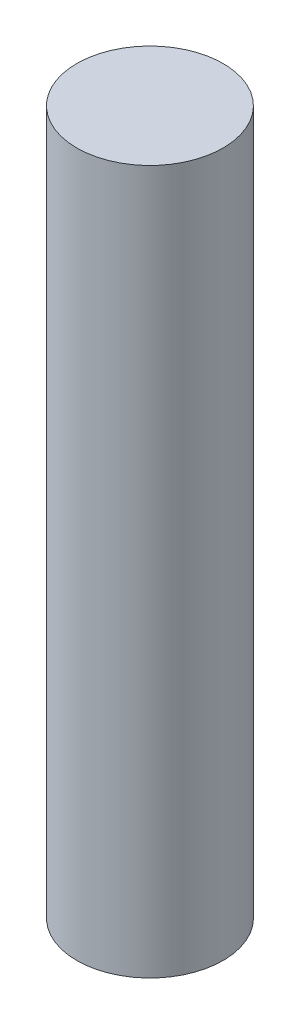
ISO-10303-21;
HEADER;
FILE_DESCRIPTION(('STEP AP214'),'2;1');
FILE_NAME('part.step','',(''),(''),'','','');
FILE_SCHEMA(('AUTOMOTIVE_DESIGN { 1 0 10303 214 1 1 1 1 }'));
ENDSEC;
DATA;
#1=APPLICATION_CONTEXT('core data for automotive mechanical design processes');
#2=APPLICATION_PROTOCOL_DEFINITION('international standard','automotive_design',2000,#1);
#3=PRODUCT_CONTEXT('',#1,'mechanical');
#4=PRODUCT('Part','Part','',(#3));
#5=PRODUCT_RELATED_PRODUCT_CATEGORY('part','',(#4));
#6=PRODUCT_DEFINITION_FORMATION('','',#4);
#7=PRODUCT_DEFINITION_CONTEXT('part definition',#1,'design');
#8=PRODUCT_DEFINITION('design','',#6,#7);
#9=PRODUCT_DEFINITION_SHAPE('','',#8);
#10=(LENGTH_UNIT() NAMED_UNIT(*) SI_UNIT(.MILLI.,.METRE.));
#11=(NAMED_UNIT(*) PLANE_ANGLE_UNIT() SI_UNIT($,.RADIAN.));
#12=(NAMED_UNIT(*) SI_UNIT($,.STERADIAN.) SOLID_ANGLE_UNIT());
#13=UNCERTAINTY_MEASURE_WITH_UNIT(LENGTH_MEASURE(1.E-05),#10,'distance_accuracy_value','');
#14=(GEOMETRIC_REPRESENTATION_CONTEXT(3) GLOBAL_UNCERTAINTY_ASSIGNED_CONTEXT((#13)) GLOBAL_UNIT_ASSIGNED_CONTEXT((#10,
#11,#12)) REPRESENTATION_CONTEXT('',''));
#15=CARTESIAN_POINT('',(0.,0.,0.));
#16=DIRECTION('',(0.,0.,1.));
#17=DIRECTION('',(1.,0.,0.));
#18=AXIS2_PLACEMENT_3D('',#15,#16,#17);
#19=CARTESIAN_POINT('',(0.,25.,0.));
#20=DIRECTION('',(0.,-1.,0.));
#21=DIRECTION('',(0.,0.,-1.));
#22=AXIS2_PLACEMENT_3D('',#19,#20,#21);
#23=CYLINDRICAL_SURFACE('',#22,2.6);
#24=CARTESIAN_POINT('',(0.,25.,0.));
#25=DIRECTION('',(0.,1.,0.));
#26=DIRECTION('',(0.,0.,1.));
#27=AXIS2_PLACEMENT_3D('',#24,#25,#26);
#28=CIRCLE('',#27,2.6);
#29=CARTESIAN_POINT('',(0.,25.,2.6));
#30=VERTEX_POINT('',#29);
#31=EDGE_CURVE('E10',#30,#30,#28,.T.);
#32=ORIENTED_EDGE('',*,*,#31,.F.);
#33=EDGE_LOOP('',(#32));
#34=FACE_BOUND('',#33,.T.);
#35=CARTESIAN_POINT('',(0.,0.,0.));
#36=DIRECTION('',(0.,1.,0.));
#37=DIRECTION('',(0.,0.,1.));
#38=AXIS2_PLACEMENT_3D('',#35,#36,#37);
#39=CIRCLE('',#38,2.6);
#40=CARTESIAN_POINT('',(0.,0.,2.6));
#41=VERTEX_POINT('',#40);
#42=EDGE_CURVE('E34',#41,#41,#39,.T.);
#43=ORIENTED_EDGE('',*,*,#42,.T.);
#44=EDGE_LOOP('',(#43));
#45=FACE_BOUND('',#44,.T.);
#46=ADVANCED_FACE('F31',(#34,#45),#23,.T.);
#47=CARTESIAN_POINT('',(0.,25.,0.));
#48=DIRECTION('',(0.,1.,0.));
#49=DIRECTION('',(0.,0.,1.));
#50=AXIS2_PLACEMENT_3D('',#47,#48,#49);
#51=PLANE('',#50);
#52=ORIENTED_EDGE('',*,*,#31,.T.);
#53=EDGE_LOOP('',(#52));
#54=FACE_BOUND('',#53,.T.);
#55=ADVANCED_FACE('F46',(#54),#51,.T.);
#56=CARTESIAN_POINT('',(0.,0.,0.));
#57=DIRECTION('',(0.,1.,0.));
#58=DIRECTION('',(0.,0.,1.));
#59=AXIS2_PLACEMENT_3D('',#56,#57,#58);
#60=PLANE('',#59);
#61=ORIENTED_EDGE('',*,*,#42,.F.);
#62=EDGE_LOOP('',(#61));
#63=FACE_BOUND('',#62,.T.);
#64=ADVANCED_FACE('F44',(#63),#60,.F.);
#65=CLOSED_SHELL('',(#46,#55,#64));
#66=MANIFOLD_SOLID_BREP('B2',#65);
#67=ADVANCED_BREP_SHAPE_REPRESENTATION('',(#18,#66),#14);
#68=SHAPE_DEFINITION_REPRESENTATION(#9,#67);
ENDSEC;
END-ISO-10303-21;
